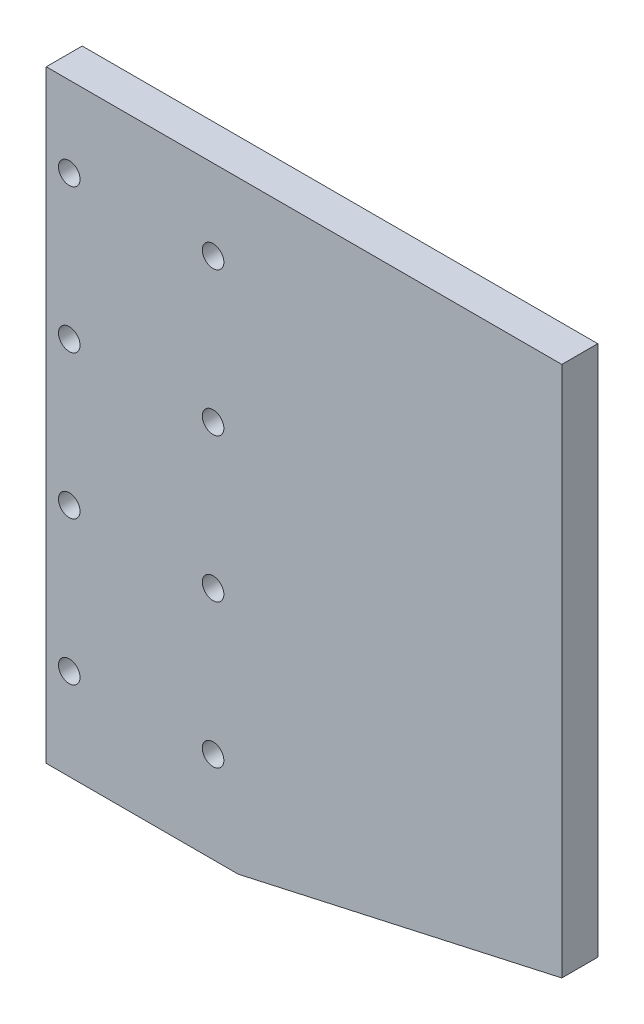
ISO-10303-21;
HEADER;
FILE_DESCRIPTION(('STEP AP214'),'2;1');
FILE_NAME('part.step','',(''),(''),'','','');
FILE_SCHEMA(('AUTOMOTIVE_DESIGN { 1 0 10303 214 1 1 1 1 }'));
ENDSEC;
DATA;
#1=APPLICATION_CONTEXT('core data for automotive mechanical design processes');
#2=APPLICATION_PROTOCOL_DEFINITION('international standard','automotive_design',2000,#1);
#3=PRODUCT_CONTEXT('',#1,'mechanical');
#4=PRODUCT('Part','Part','',(#3));
#5=PRODUCT_RELATED_PRODUCT_CATEGORY('part','',(#4));
#6=PRODUCT_DEFINITION_FORMATION('','',#4);
#7=PRODUCT_DEFINITION_CONTEXT('part definition',#1,'design');
#8=PRODUCT_DEFINITION('design','',#6,#7);
#9=PRODUCT_DEFINITION_SHAPE('','',#8);
#10=(LENGTH_UNIT() NAMED_UNIT(*) SI_UNIT(.MILLI.,.METRE.));
#11=(NAMED_UNIT(*) PLANE_ANGLE_UNIT() SI_UNIT($,.RADIAN.));
#12=(NAMED_UNIT(*) SI_UNIT($,.STERADIAN.) SOLID_ANGLE_UNIT());
#13=UNCERTAINTY_MEASURE_WITH_UNIT(LENGTH_MEASURE(1.E-05),#10,'distance_accuracy_value','');
#14=(GEOMETRIC_REPRESENTATION_CONTEXT(3) GLOBAL_UNCERTAINTY_ASSIGNED_CONTEXT((#13)) GLOBAL_UNIT_ASSIGNED_CONTEXT((#10,
#11,#12)) REPRESENTATION_CONTEXT('',''));
#15=CARTESIAN_POINT('',(0.,0.,0.));
#16=DIRECTION('',(0.,0.,1.));
#17=DIRECTION('',(1.,0.,0.));
#18=AXIS2_PLACEMENT_3D('',#15,#16,#17);
#19=CARTESIAN_POINT('',(0.,21.1999999999984,5.));
#20=DIRECTION('',(0.,-1.,0.));
#21=DIRECTION('',(0.,0.,-1.));
#22=AXIS2_PLACEMENT_3D('',#19,#20,#21);
#23=PLANE('',#22);
#24=DIRECTION('',(-1.,0.,0.));
#25=VECTOR('',#24,1.);
#26=CARTESIAN_POINT('',(0.,21.1999999999984,0.));
#27=LINE('',#26,#25);
#28=CARTESIAN_POINT('',(58.4999890889247,21.1999999999984,5.38523430254291E-09));
#29=VERTEX_POINT('',#28);
#30=CARTESIAN_POINT('',(-13.199989197131,21.1999999999984,0.));
#31=VERTEX_POINT('',#30);
#32=EDGE_CURVE('E102',#29,#31,#27,.T.);
#33=ORIENTED_EDGE('',*,*,#32,.T.);
#34=DIRECTION('',(0.,0.,-1.));
#35=VECTOR('',#34,1.);
#36=CARTESIAN_POINT('',(-13.199989197131,21.1999999999984,5.));
#37=LINE('',#36,#35);
#38=CARTESIAN_POINT('',(-13.199989197131,21.1999999999984,5.));
#39=VERTEX_POINT('',#38);
#40=EDGE_CURVE('E11',#39,#31,#37,.T.);
#41=ORIENTED_EDGE('',*,*,#40,.F.);
#42=DIRECTION('',(-1.,0.,0.));
#43=VECTOR('',#42,1.);
#44=CARTESIAN_POINT('',(0.,21.1999999999984,5.));
#45=LINE('',#44,#43);
#46=CARTESIAN_POINT('',(58.4999890889247,21.1999999999984,5.));
#47=VERTEX_POINT('',#46);
#48=EDGE_CURVE('E55',#47,#39,#45,.T.);
#49=ORIENTED_EDGE('',*,*,#48,.F.);
#50=DIRECTION('',(0.,0.,1.));
#51=VECTOR('',#50,1.);
#52=CARTESIAN_POINT('',(58.4999890889247,21.1999999999984,-79.9525484241004));
#53=LINE('',#52,#51);
#54=EDGE_CURVE('E109',#29,#47,#53,.T.);
#55=ORIENTED_EDGE('',*,*,#54,.F.);
#56=EDGE_LOOP('',(#33,#41,#49,#55));
#57=FACE_BOUND('',#56,.T.);
#58=ADVANCED_FACE('F41',(#57),#23,.F.);
#59=CARTESIAN_POINT('',(9.99999999999923,-10.0000000000016,5.));
#60=DIRECTION('',(0.,0.,-1.));
#61=DIRECTION('',(-1.,0.,0.));
#62=AXIS2_PLACEMENT_3D('',#59,#60,#61);
#63=CYLINDRICAL_SURFACE('',#62,1.5);
#64=CARTESIAN_POINT('',(9.99999999999923,-10.0000000000016,5.));
#65=DIRECTION('',(0.,0.,1.));
#66=DIRECTION('',(1.,0.,0.));
#67=AXIS2_PLACEMENT_3D('',#64,#65,#66);
#68=CIRCLE('',#67,1.5);
#69=CARTESIAN_POINT('',(11.4999999999992,-10.0000000000016,5.));
#70=VERTEX_POINT('',#69);
#71=EDGE_CURVE('E156',#70,#70,#68,.T.);
#72=ORIENTED_EDGE('',*,*,#71,.T.);
#73=EDGE_LOOP('',(#72));
#74=FACE_BOUND('',#73,.T.);
#75=CARTESIAN_POINT('',(9.99999999999923,-10.0000000000016,0.));
#76=DIRECTION('',(0.,0.,1.));
#77=DIRECTION('',(1.,0.,0.));
#78=AXIS2_PLACEMENT_3D('',#75,#76,#77);
#79=CIRCLE('',#78,1.5);
#80=CARTESIAN_POINT('',(11.4999999999992,-10.0000000000016,0.));
#81=VERTEX_POINT('',#80);
#82=EDGE_CURVE('E170',#81,#81,#79,.T.);
#83=ORIENTED_EDGE('',*,*,#82,.F.);
#84=EDGE_LOOP('',(#83));
#85=FACE_BOUND('',#84,.T.);
#86=ADVANCED_FACE('F194',(#74,#85),#63,.F.);
#87=CARTESIAN_POINT('',(-10.0000000000008,-10.0000000000016,5.));
#88=DIRECTION('',(0.,0.,-1.));
#89=DIRECTION('',(-1.,0.,0.));
#90=AXIS2_PLACEMENT_3D('',#87,#88,#89);
#91=CYLINDRICAL_SURFACE('',#90,1.5);
#92=CARTESIAN_POINT('',(-10.0000000000008,-10.0000000000016,5.));
#93=DIRECTION('',(0.,0.,1.));
#94=DIRECTION('',(1.,0.,0.));
#95=AXIS2_PLACEMENT_3D('',#92,#93,#94);
#96=CIRCLE('',#95,1.5);
#97=CARTESIAN_POINT('',(-8.50000000000078,-10.0000000000016,5.));
#98=VERTEX_POINT('',#97);
#99=EDGE_CURVE('E153',#98,#98,#96,.T.);
#100=ORIENTED_EDGE('',*,*,#99,.T.);
#101=EDGE_LOOP('',(#100));
#102=FACE_BOUND('',#101,.T.);
#103=CARTESIAN_POINT('',(-10.0000000000008,-10.0000000000016,0.));
#104=DIRECTION('',(0.,0.,1.));
#105=DIRECTION('',(1.,0.,0.));
#106=AXIS2_PLACEMENT_3D('',#103,#104,#105);
#107=CIRCLE('',#106,1.5);
#108=CARTESIAN_POINT('',(-8.50000000000078,-10.0000000000016,0.));
#109=VERTEX_POINT('',#108);
#110=EDGE_CURVE('E167',#109,#109,#107,.T.);
#111=ORIENTED_EDGE('',*,*,#110,.F.);
#112=EDGE_LOOP('',(#111));
#113=FACE_BOUND('',#112,.T.);
#114=ADVANCED_FACE('F200',(#102,#113),#91,.F.);
#115=CARTESIAN_POINT('',(-10.0000000000008,9.99999999999845,5.));
#116=DIRECTION('',(0.,0.,-1.));
#117=DIRECTION('',(-1.,0.,0.));
#118=AXIS2_PLACEMENT_3D('',#115,#116,#117);
#119=CYLINDRICAL_SURFACE('',#118,1.5);
#120=CARTESIAN_POINT('',(-10.0000000000008,9.99999999999845,5.));
#121=DIRECTION('',(0.,0.,1.));
#122=DIRECTION('',(1.,0.,0.));
#123=AXIS2_PLACEMENT_3D('',#120,#121,#122);
#124=CIRCLE('',#123,1.5);
#125=CARTESIAN_POINT('',(-8.50000000000078,9.99999999999845,5.));
#126=VERTEX_POINT('',#125);
#127=EDGE_CURVE('E150',#126,#126,#124,.T.);
#128=ORIENTED_EDGE('',*,*,#127,.T.);
#129=EDGE_LOOP('',(#128));
#130=FACE_BOUND('',#129,.T.);
#131=CARTESIAN_POINT('',(-10.0000000000008,9.99999999999845,0.));
#132=DIRECTION('',(0.,0.,1.));
#133=DIRECTION('',(1.,0.,0.));
#134=AXIS2_PLACEMENT_3D('',#131,#132,#133);
#135=CIRCLE('',#134,1.5);
#136=CARTESIAN_POINT('',(-8.50000000000078,9.99999999999845,0.));
#137=VERTEX_POINT('',#136);
#138=EDGE_CURVE('E164',#137,#137,#135,.T.);
#139=ORIENTED_EDGE('',*,*,#138,.F.);
#140=EDGE_LOOP('',(#139));
#141=FACE_BOUND('',#140,.T.);
#142=ADVANCED_FACE('F189',(#130,#141),#119,.F.);
#143=CARTESIAN_POINT('',(-13.1999891971173,0.,5.));
#144=DIRECTION('',(1.,0.,0.));
#145=DIRECTION('',(0.,0.,-1.));
#146=AXIS2_PLACEMENT_3D('',#143,#144,#145);
#147=PLANE('',#146);
#148=DIRECTION('',(0.,-1.,0.));
#149=VECTOR('',#148,1.);
#150=CARTESIAN_POINT('',(-13.1999891971173,0.,0.));
#151=LINE('',#150,#149);
#152=CARTESIAN_POINT('',(-13.1999891971173,-62.6999999999995,0.));
#153=VERTEX_POINT('',#152);
#154=EDGE_CURVE('E162',#31,#153,#151,.T.);
#155=ORIENTED_EDGE('',*,*,#154,.T.);
#156=DIRECTION('',(0.,0.,1.));
#157=VECTOR('',#156,1.);
#158=CARTESIAN_POINT('',(-13.1999891971173,-62.6999999999995,0.));
#159=LINE('',#158,#157);
#160=CARTESIAN_POINT('',(-13.1999891971173,-62.6999999999995,5.));
#161=VERTEX_POINT('',#160);
#162=EDGE_CURVE('E140',#153,#161,#159,.T.);
#163=ORIENTED_EDGE('',*,*,#162,.T.);
#164=DIRECTION('',(0.,-1.,0.));
#165=VECTOR('',#164,1.);
#166=CARTESIAN_POINT('',(-13.1999891971173,0.,5.));
#167=LINE('',#166,#165);
#168=EDGE_CURVE('E147',#39,#161,#167,.T.);
#169=ORIENTED_EDGE('',*,*,#168,.F.);
#170=ORIENTED_EDGE('',*,*,#40,.T.);
#171=EDGE_LOOP('',(#155,#163,#169,#170));
#172=FACE_BOUND('',#171,.T.);
#173=ADVANCED_FACE('F179',(#172),#147,.F.);
#174=CARTESIAN_POINT('',(9.99999999999923,9.99999999999845,5.));
#175=DIRECTION('',(0.,0.,-1.));
#176=DIRECTION('',(-1.,0.,0.));
#177=AXIS2_PLACEMENT_3D('',#174,#175,#176);
#178=CYLINDRICAL_SURFACE('',#177,1.5);
#179=CARTESIAN_POINT('',(9.99999999999923,9.99999999999845,5.));
#180=DIRECTION('',(0.,0.,1.));
#181=DIRECTION('',(1.,0.,0.));
#182=AXIS2_PLACEMENT_3D('',#179,#180,#181);
#183=CIRCLE('',#182,1.5);
#184=CARTESIAN_POINT('',(11.4999999999992,9.99999999999845,5.));
#185=VERTEX_POINT('',#184);
#186=EDGE_CURVE('E49',#185,#185,#183,.T.);
#187=ORIENTED_EDGE('',*,*,#186,.T.);
#188=EDGE_LOOP('',(#187));
#189=FACE_BOUND('',#188,.T.);
#190=CARTESIAN_POINT('',(9.99999999999923,9.99999999999845,0.));
#191=DIRECTION('',(0.,0.,1.));
#192=DIRECTION('',(1.,0.,0.));
#193=AXIS2_PLACEMENT_3D('',#190,#191,#192);
#194=CIRCLE('',#193,1.5);
#195=CARTESIAN_POINT('',(11.4999999999992,9.99999999999845,0.));
#196=VERTEX_POINT('',#195);
#197=EDGE_CURVE('E148',#196,#196,#194,.T.);
#198=ORIENTED_EDGE('',*,*,#197,.F.);
#199=EDGE_LOOP('',(#198));
#200=FACE_BOUND('',#199,.T.);
#201=ADVANCED_FACE('F176',(#189,#200),#178,.F.);
#202=CARTESIAN_POINT('',(0.,0.,5.));
#203=DIRECTION('',(0.,0.,1.));
#204=DIRECTION('',(1.,0.,0.));
#205=AXIS2_PLACEMENT_3D('',#202,#203,#204);
#206=PLANE('',#205);
#207=CARTESIAN_POINT('',(10.0000000000528,-49.9999999999829,5.));
#208=DIRECTION('',(0.,0.,1.));
#209=DIRECTION('',(1.,0.,0.));
#210=AXIS2_PLACEMENT_3D('',#207,#208,#209);
#211=CIRCLE('',#210,1.5);
#212=CARTESIAN_POINT('',(11.5000000000528,-49.9999999999829,5.));
#213=VERTEX_POINT('',#212);
#214=EDGE_CURVE('E127',#213,#213,#211,.T.);
#215=ORIENTED_EDGE('',*,*,#214,.F.);
#216=EDGE_LOOP('',(#215));
#217=FACE_BOUND('',#216,.T.);
#218=CARTESIAN_POINT('',(-9.99999999994739,-29.9999999999829,5.));
#219=DIRECTION('',(0.,0.,1.));
#220=DIRECTION('',(1.,0.,0.));
#221=AXIS2_PLACEMENT_3D('',#218,#219,#220);
#222=CIRCLE('',#221,1.5);
#223=CARTESIAN_POINT('',(-8.49999999994739,-29.9999999999829,5.));
#224=VERTEX_POINT('',#223);
#225=EDGE_CURVE('E120',#224,#224,#222,.T.);
#226=ORIENTED_EDGE('',*,*,#225,.F.);
#227=EDGE_LOOP('',(#226));
#228=FACE_BOUND('',#227,.T.);
#229=CARTESIAN_POINT('',(10.0000000000526,-29.9999999999829,5.));
#230=DIRECTION('',(0.,0.,1.));
#231=DIRECTION('',(1.,0.,0.));
#232=AXIS2_PLACEMENT_3D('',#229,#230,#231);
#233=CIRCLE('',#232,1.5);
#234=CARTESIAN_POINT('',(11.5000000000526,-29.9999999999829,5.));
#235=VERTEX_POINT('',#234);
#236=EDGE_CURVE('E132',#235,#235,#233,.T.);
#237=ORIENTED_EDGE('',*,*,#236,.F.);
#238=EDGE_LOOP('',(#237));
#239=FACE_BOUND('',#238,.T.);
#240=CARTESIAN_POINT('',(-9.99999999994718,-49.9999999999829,5.));
#241=DIRECTION('',(0.,0.,1.));
#242=DIRECTION('',(1.,0.,0.));
#243=AXIS2_PLACEMENT_3D('',#240,#241,#242);
#244=CIRCLE('',#243,1.5);
#245=CARTESIAN_POINT('',(-8.49999999994718,-49.9999999999829,5.));
#246=VERTEX_POINT('',#245);
#247=EDGE_CURVE('E114',#246,#246,#244,.T.);
#248=ORIENTED_EDGE('',*,*,#247,.F.);
#249=EDGE_LOOP('',(#248));
#250=FACE_BOUND('',#249,.T.);
#251=ORIENTED_EDGE('',*,*,#168,.T.);
#252=DIRECTION('',(1.,0.,0.));
#253=VECTOR('',#252,1.);
#254=CARTESIAN_POINT('',(-13.1999891971173,-62.6999999999995,5.));
#255=LINE('',#254,#253);
#256=CARTESIAN_POINT('',(13.4999891971438,-62.6999999999995,5.));
#257=VERTEX_POINT('',#256);
#258=EDGE_CURVE('E135',#161,#257,#255,.T.);
#259=ORIENTED_EDGE('',*,*,#258,.T.);
#260=DIRECTION('',(0.976187060018005,0.216930458565422,0.));
#261=VECTOR('',#260,1.);
#262=CARTESIAN_POINT('',(13.9129407159247,-62.6082329954945,5.));
#263=LINE('',#262,#261);
#264=CARTESIAN_POINT('',(58.4999890889247,-52.6999999879241,5.));
#265=VERTEX_POINT('',#264);
#266=EDGE_CURVE('E95',#257,#265,#263,.T.);
#267=ORIENTED_EDGE('',*,*,#266,.T.);
#268=DIRECTION('',(0.,-1.,0.));
#269=VECTOR('',#268,1.);
#270=CARTESIAN_POINT('',(58.4999890889247,0.,5.));
#271=LINE('',#270,#269);
#272=EDGE_CURVE('E108',#47,#265,#271,.T.);
#273=ORIENTED_EDGE('',*,*,#272,.F.);
#274=ORIENTED_EDGE('',*,*,#48,.T.);
#275=EDGE_LOOP('',(#251,#259,#267,#273,#274));
#276=FACE_BOUND('',#275,.T.);
#277=ORIENTED_EDGE('',*,*,#127,.F.);
#278=EDGE_LOOP('',(#277));
#279=FACE_BOUND('',#278,.T.);
#280=ORIENTED_EDGE('',*,*,#99,.F.);
#281=EDGE_LOOP('',(#280));
#282=FACE_BOUND('',#281,.T.);
#283=ORIENTED_EDGE('',*,*,#71,.F.);
#284=EDGE_LOOP('',(#283));
#285=FACE_BOUND('',#284,.T.);
#286=ORIENTED_EDGE('',*,*,#186,.F.);
#287=EDGE_LOOP('',(#286));
#288=FACE_BOUND('',#287,.T.);
#289=ADVANCED_FACE('F178',(#217,#228,#239,#250,#276,#279,#282,#285,#288),#206,.T.);
#290=CARTESIAN_POINT('',(0.,0.,0.));
#291=DIRECTION('',(0.,0.,1.));
#292=DIRECTION('',(1.,0.,0.));
#293=AXIS2_PLACEMENT_3D('',#290,#291,#292);
#294=PLANE('',#293);
#295=CARTESIAN_POINT('',(10.0000000000528,-49.9999999999829,0.));
#296=DIRECTION('',(0.,0.,1.));
#297=DIRECTION('',(1.,0.,0.));
#298=AXIS2_PLACEMENT_3D('',#295,#296,#297);
#299=CIRCLE('',#298,1.5);
#300=CARTESIAN_POINT('',(11.5000000000528,-49.9999999999829,0.));
#301=VERTEX_POINT('',#300);
#302=EDGE_CURVE('E117',#301,#301,#299,.T.);
#303=ORIENTED_EDGE('',*,*,#302,.T.);
#304=EDGE_LOOP('',(#303));
#305=FACE_BOUND('',#304,.T.);
#306=CARTESIAN_POINT('',(-9.99999999994739,-29.9999999999829,0.));
#307=DIRECTION('',(0.,0.,1.));
#308=DIRECTION('',(1.,0.,0.));
#309=AXIS2_PLACEMENT_3D('',#306,#307,#308);
#310=CIRCLE('',#309,1.5);
#311=CARTESIAN_POINT('',(-8.49999999994739,-29.9999999999829,0.));
#312=VERTEX_POINT('',#311);
#313=EDGE_CURVE('E124',#312,#312,#310,.T.);
#314=ORIENTED_EDGE('',*,*,#313,.T.);
#315=EDGE_LOOP('',(#314));
#316=FACE_BOUND('',#315,.T.);
#317=CARTESIAN_POINT('',(10.0000000000526,-29.9999999999829,0.));
#318=DIRECTION('',(0.,0.,1.));
#319=DIRECTION('',(1.,0.,0.));
#320=AXIS2_PLACEMENT_3D('',#317,#318,#319);
#321=CIRCLE('',#320,1.5);
#322=CARTESIAN_POINT('',(11.5000000000526,-29.9999999999829,0.));
#323=VERTEX_POINT('',#322);
#324=EDGE_CURVE('E123',#323,#323,#321,.T.);
#325=ORIENTED_EDGE('',*,*,#324,.T.);
#326=EDGE_LOOP('',(#325));
#327=FACE_BOUND('',#326,.T.);
#328=CARTESIAN_POINT('',(-9.99999999994718,-49.9999999999829,0.));
#329=DIRECTION('',(0.,0.,1.));
#330=DIRECTION('',(1.,0.,0.));
#331=AXIS2_PLACEMENT_3D('',#328,#329,#330);
#332=CIRCLE('',#331,1.5);
#333=CARTESIAN_POINT('',(-8.49999999994718,-49.9999999999829,0.));
#334=VERTEX_POINT('',#333);
#335=EDGE_CURVE('E94',#334,#334,#332,.T.);
#336=ORIENTED_EDGE('',*,*,#335,.T.);
#337=EDGE_LOOP('',(#336));
#338=FACE_BOUND('',#337,.T.);
#339=ORIENTED_EDGE('',*,*,#32,.F.);
#340=DIRECTION('',(0.,-1.,0.));
#341=VECTOR('',#340,1.);
#342=CARTESIAN_POINT('',(58.4999890889247,1.03253782158976E-13,5.38526168103459E-09));
#343=LINE('',#342,#341);
#344=CARTESIAN_POINT('',(58.4999890889247,-52.6999999879241,5.38558087015417E-09));
#345=VERTEX_POINT('',#344);
#346=EDGE_CURVE('E98',#29,#345,#343,.T.);
#347=ORIENTED_EDGE('',*,*,#346,.T.);
#348=DIRECTION('',(0.976187060018005,0.216930458565422,0.));
#349=VECTOR('',#348,1.);
#350=CARTESIAN_POINT('',(13.9129407159247,-62.6082329954945,0.));
#351=LINE('',#350,#349);
#352=CARTESIAN_POINT('',(13.4999891971453,-62.6999999999995,0.));
#353=VERTEX_POINT('',#352);
#354=EDGE_CURVE('E83',#353,#345,#351,.T.);
#355=ORIENTED_EDGE('',*,*,#354,.F.);
#356=DIRECTION('',(1.,0.,0.));
#357=VECTOR('',#356,1.);
#358=CARTESIAN_POINT('',(-13.1999891971173,-62.6999999999995,0.));
#359=LINE('',#358,#357);
#360=EDGE_CURVE('E138',#153,#353,#359,.T.);
#361=ORIENTED_EDGE('',*,*,#360,.F.);
#362=ORIENTED_EDGE('',*,*,#154,.F.);
#363=EDGE_LOOP('',(#339,#347,#355,#361,#362));
#364=FACE_BOUND('',#363,.T.);
#365=ORIENTED_EDGE('',*,*,#138,.T.);
#366=EDGE_LOOP('',(#365));
#367=FACE_BOUND('',#366,.T.);
#368=ORIENTED_EDGE('',*,*,#110,.T.);
#369=EDGE_LOOP('',(#368));
#370=FACE_BOUND('',#369,.T.);
#371=ORIENTED_EDGE('',*,*,#82,.T.);
#372=EDGE_LOOP('',(#371));
#373=FACE_BOUND('',#372,.T.);
#374=ORIENTED_EDGE('',*,*,#197,.T.);
#375=EDGE_LOOP('',(#374));
#376=FACE_BOUND('',#375,.T.);
#377=ADVANCED_FACE('F99',(#305,#316,#327,#338,#364,#367,#370,#373,#376),#294,.F.);
#378=CARTESIAN_POINT('',(-13.1999891971173,-62.6999999999995,0.));
#379=DIRECTION('',(0.,-1.,0.));
#380=DIRECTION('',(0.,0.,-1.));
#381=AXIS2_PLACEMENT_3D('',#378,#379,#380);
#382=PLANE('',#381);
#383=ORIENTED_EDGE('',*,*,#258,.F.);
#384=ORIENTED_EDGE('',*,*,#162,.F.);
#385=ORIENTED_EDGE('',*,*,#360,.T.);
#386=DIRECTION('',(0.,0.,1.));
#387=VECTOR('',#386,1.);
#388=CARTESIAN_POINT('',(13.4999891971438,-62.6999999999995,0.));
#389=LINE('',#388,#387);
#390=EDGE_CURVE('E90',#353,#257,#389,.T.);
#391=ORIENTED_EDGE('',*,*,#390,.T.);
#392=EDGE_LOOP('',(#383,#384,#385,#391));
#393=FACE_BOUND('',#392,.T.);
#394=ADVANCED_FACE('F206',(#393),#382,.T.);
#395=CARTESIAN_POINT('',(-9.99999999994718,-49.9999999999829,0.));
#396=DIRECTION('',(0.,0.,1.));
#397=DIRECTION('',(1.,0.,0.));
#398=AXIS2_PLACEMENT_3D('',#395,#396,#397);
#399=CYLINDRICAL_SURFACE('',#398,1.5);
#400=ORIENTED_EDGE('',*,*,#335,.F.);
#401=EDGE_LOOP('',(#400));
#402=FACE_BOUND('',#401,.T.);
#403=ORIENTED_EDGE('',*,*,#247,.T.);
#404=EDGE_LOOP('',(#403));
#405=FACE_BOUND('',#404,.T.);
#406=ADVANCED_FACE('F224',(#402,#405),#399,.F.);
#407=CARTESIAN_POINT('',(10.0000000000526,-29.9999999999829,0.));
#408=DIRECTION('',(0.,0.,1.));
#409=DIRECTION('',(1.,0.,0.));
#410=AXIS2_PLACEMENT_3D('',#407,#408,#409);
#411=CYLINDRICAL_SURFACE('',#410,1.5);
#412=ORIENTED_EDGE('',*,*,#324,.F.);
#413=EDGE_LOOP('',(#412));
#414=FACE_BOUND('',#413,.T.);
#415=ORIENTED_EDGE('',*,*,#236,.T.);
#416=EDGE_LOOP('',(#415));
#417=FACE_BOUND('',#416,.T.);
#418=ADVANCED_FACE('F228',(#414,#417),#411,.F.);
#419=CARTESIAN_POINT('',(-9.99999999994739,-29.9999999999829,0.));
#420=DIRECTION('',(0.,0.,1.));
#421=DIRECTION('',(1.,0.,0.));
#422=AXIS2_PLACEMENT_3D('',#419,#420,#421);
#423=CYLINDRICAL_SURFACE('',#422,1.5);
#424=ORIENTED_EDGE('',*,*,#313,.F.);
#425=EDGE_LOOP('',(#424));
#426=FACE_BOUND('',#425,.T.);
#427=ORIENTED_EDGE('',*,*,#225,.T.);
#428=EDGE_LOOP('',(#427));
#429=FACE_BOUND('',#428,.T.);
#430=ADVANCED_FACE('F231',(#426,#429),#423,.F.);
#431=CARTESIAN_POINT('',(10.0000000000528,-49.9999999999829,0.));
#432=DIRECTION('',(0.,0.,1.));
#433=DIRECTION('',(1.,0.,0.));
#434=AXIS2_PLACEMENT_3D('',#431,#432,#433);
#435=CYLINDRICAL_SURFACE('',#434,1.5);
#436=ORIENTED_EDGE('',*,*,#302,.F.);
#437=EDGE_LOOP('',(#436));
#438=FACE_BOUND('',#437,.T.);
#439=ORIENTED_EDGE('',*,*,#214,.T.);
#440=EDGE_LOOP('',(#439));
#441=FACE_BOUND('',#440,.T.);
#442=ADVANCED_FACE('F233',(#438,#441),#435,.F.);
#443=CARTESIAN_POINT('',(13.9129407159247,-62.6082329954945,0.));
#444=DIRECTION('',(0.216930458565422,-0.976187060018005,0.));
#445=DIRECTION('',(0.976187060018005,0.216930458565422,0.));
#446=AXIS2_PLACEMENT_3D('',#443,#444,#445);
#447=PLANE('',#446);
#448=ORIENTED_EDGE('',*,*,#266,.F.);
#449=ORIENTED_EDGE('',*,*,#390,.F.);
#450=ORIENTED_EDGE('',*,*,#354,.T.);
#451=DIRECTION('',(0.,0.,1.));
#452=VECTOR('',#451,1.);
#453=CARTESIAN_POINT('',(58.4999890889247,-52.6999999879241,-79.9525484241004));
#454=LINE('',#453,#452);
#455=EDGE_CURVE('E87',#345,#265,#454,.T.);
#456=ORIENTED_EDGE('',*,*,#455,.T.);
#457=EDGE_LOOP('',(#448,#449,#450,#456));
#458=FACE_BOUND('',#457,.T.);
#459=ADVANCED_FACE('F85',(#458),#447,.T.);
#460=CARTESIAN_POINT('',(58.4999890889247,0.,-79.9525484241004));
#461=DIRECTION('',(-1.,0.,0.));
#462=DIRECTION('',(0.,0.,1.));
#463=AXIS2_PLACEMENT_3D('',#460,#461,#462);
#464=PLANE('',#463);
#465=ORIENTED_EDGE('',*,*,#346,.F.);
#466=ORIENTED_EDGE('',*,*,#54,.T.);
#467=ORIENTED_EDGE('',*,*,#272,.T.);
#468=ORIENTED_EDGE('',*,*,#455,.F.);
#469=EDGE_LOOP('',(#465,#466,#467,#468));
#470=FACE_BOUND('',#469,.T.);
#471=ADVANCED_FACE('F107',(#470),#464,.F.);
#472=CLOSED_SHELL('',(#58,#86,#114,#142,#173,#201,#289,#377,#394,#406,#418,#430,#442,#459,#471));
#473=MANIFOLD_SOLID_BREP('B2',#472);
#474=ADVANCED_BREP_SHAPE_REPRESENTATION('',(#18,#473),#14);
#475=SHAPE_DEFINITION_REPRESENTATION(#9,#474);
ENDSEC;
END-ISO-10303-21;
